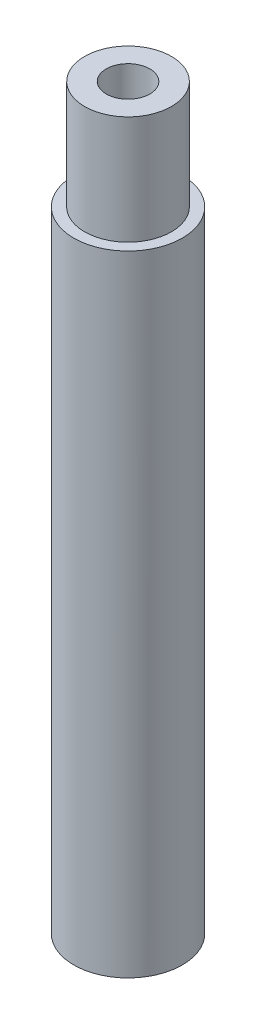
ISO-10303-21;
HEADER;
FILE_DESCRIPTION(('STEP AP214'),'2;1');
FILE_NAME('part.step','',(''),(''),'','','');
FILE_SCHEMA(('AUTOMOTIVE_DESIGN { 1 0 10303 214 1 1 1 1 }'));
ENDSEC;
DATA;
#1=APPLICATION_CONTEXT('core data for automotive mechanical design processes');
#2=APPLICATION_PROTOCOL_DEFINITION('international standard','automotive_design',2000,#1);
#3=PRODUCT_CONTEXT('',#1,'mechanical');
#4=PRODUCT('Part','Part','',(#3));
#5=PRODUCT_RELATED_PRODUCT_CATEGORY('part','',(#4));
#6=PRODUCT_DEFINITION_FORMATION('','',#4);
#7=PRODUCT_DEFINITION_CONTEXT('part definition',#1,'design');
#8=PRODUCT_DEFINITION('design','',#6,#7);
#9=PRODUCT_DEFINITION_SHAPE('','',#8);
#10=(LENGTH_UNIT() NAMED_UNIT(*) SI_UNIT(.MILLI.,.METRE.));
#11=(NAMED_UNIT(*) PLANE_ANGLE_UNIT() SI_UNIT($,.RADIAN.));
#12=(NAMED_UNIT(*) SI_UNIT($,.STERADIAN.) SOLID_ANGLE_UNIT());
#13=UNCERTAINTY_MEASURE_WITH_UNIT(LENGTH_MEASURE(1.E-05),#10,'distance_accuracy_value','');
#14=(GEOMETRIC_REPRESENTATION_CONTEXT(3) GLOBAL_UNCERTAINTY_ASSIGNED_CONTEXT((#13)) GLOBAL_UNIT_ASSIGNED_CONTEXT((#10,
#11,#12)) REPRESENTATION_CONTEXT('',''));
#15=CARTESIAN_POINT('',(0.,0.,0.));
#16=DIRECTION('',(0.,0.,1.));
#17=DIRECTION('',(1.,0.,0.));
#18=AXIS2_PLACEMENT_3D('',#15,#16,#17);
#19=CARTESIAN_POINT('',(0.,203.2,0.));
#20=DIRECTION('',(0.,1.,0.));
#21=DIRECTION('',(0.,0.,1.));
#22=AXIS2_PLACEMENT_3D('',#19,#20,#21);
#23=PLANE('',#22);
#24=CARTESIAN_POINT('',(0.,203.2,0.));
#25=DIRECTION('',(0.,1.,0.));
#26=DIRECTION('',(0.,0.,1.));
#27=AXIS2_PLACEMENT_3D('',#24,#25,#26);
#28=CIRCLE('',#27,6.3754);
#29=CARTESIAN_POINT('',(0.,203.2,6.3754));
#30=VERTEX_POINT('',#29);
#31=EDGE_CURVE('E10',#30,#30,#28,.T.);
#32=ORIENTED_EDGE('',*,*,#31,.F.);
#33=EDGE_LOOP('',(#32));
#34=FACE_BOUND('',#33,.T.);
#35=CARTESIAN_POINT('',(0.,203.2,0.));
#36=DIRECTION('',(0.,1.,0.));
#37=DIRECTION('',(0.,0.,1.));
#38=AXIS2_PLACEMENT_3D('',#35,#36,#37);
#39=CIRCLE('',#38,12.7);
#40=CARTESIAN_POINT('',(0.,203.2,12.7));
#41=VERTEX_POINT('',#40);
#42=EDGE_CURVE('E60',#41,#41,#39,.T.);
#43=ORIENTED_EDGE('',*,*,#42,.T.);
#44=EDGE_LOOP('',(#43));
#45=FACE_BOUND('',#44,.T.);
#46=ADVANCED_FACE('F35',(#34,#45),#23,.T.);
#47=CARTESIAN_POINT('',(0.,203.2,0.));
#48=DIRECTION('',(0.,-1.,0.));
#49=DIRECTION('',(0.,0.,-1.));
#50=AXIS2_PLACEMENT_3D('',#47,#48,#49);
#51=CYLINDRICAL_SURFACE('',#50,15.875);
#52=CARTESIAN_POINT('',(0.,-12.7,0.));
#53=DIRECTION('',(0.,-1.,0.));
#54=DIRECTION('',(0.,0.,-1.));
#55=AXIS2_PLACEMENT_3D('',#52,#53,#54);
#56=CIRCLE('',#55,15.875);
#57=CARTESIAN_POINT('',(0.,-12.7,-15.875));
#58=VERTEX_POINT('',#57);
#59=EDGE_CURVE('E46',#58,#58,#56,.T.);
#60=ORIENTED_EDGE('',*,*,#59,.F.);
#61=EDGE_LOOP('',(#60));
#62=FACE_BOUND('',#61,.T.);
#63=CARTESIAN_POINT('',(0.,171.45,0.));
#64=DIRECTION('',(0.,1.,0.));
#65=DIRECTION('',(0.,0.,1.));
#66=AXIS2_PLACEMENT_3D('',#63,#64,#65);
#67=CIRCLE('',#66,15.875);
#68=CARTESIAN_POINT('',(0.,171.45,15.875));
#69=VERTEX_POINT('',#68);
#70=EDGE_CURVE('E54',#69,#69,#67,.T.);
#71=ORIENTED_EDGE('',*,*,#70,.F.);
#72=EDGE_LOOP('',(#71));
#73=FACE_BOUND('',#72,.T.);
#74=ADVANCED_FACE('F37',(#62,#73),#51,.T.);
#75=CARTESIAN_POINT('',(0.,0.,0.));
#76=DIRECTION('',(0.,1.,0.));
#77=DIRECTION('',(0.,0.,1.));
#78=AXIS2_PLACEMENT_3D('',#75,#76,#77);
#79=PLANE('',#78);
#80=CARTESIAN_POINT('',(0.,0.,0.));
#81=DIRECTION('',(0.,1.,0.));
#82=DIRECTION('',(0.,0.,1.));
#83=AXIS2_PLACEMENT_3D('',#80,#81,#82);
#84=CIRCLE('',#83,6.3754);
#85=CARTESIAN_POINT('',(0.,0.,6.3754));
#86=VERTEX_POINT('',#85);
#87=EDGE_CURVE('E39',#86,#86,#84,.T.);
#88=ORIENTED_EDGE('',*,*,#87,.T.);
#89=EDGE_LOOP('',(#88));
#90=FACE_BOUND('',#89,.T.);
#91=CARTESIAN_POINT('',(0.,0.,0.));
#92=DIRECTION('',(0.,-1.,0.));
#93=DIRECTION('',(0.,0.,-1.));
#94=AXIS2_PLACEMENT_3D('',#91,#92,#93);
#95=CIRCLE('',#94,12.7);
#96=CARTESIAN_POINT('',(0.,0.,-12.7));
#97=VERTEX_POINT('',#96);
#98=EDGE_CURVE('E51',#97,#97,#95,.T.);
#99=ORIENTED_EDGE('',*,*,#98,.T.);
#100=EDGE_LOOP('',(#99));
#101=FACE_BOUND('',#100,.T.);
#102=ADVANCED_FACE('F77',(#90,#101),#79,.F.);
#103=CARTESIAN_POINT('',(0.,203.2,0.));
#104=DIRECTION('',(0.,-1.,0.));
#105=DIRECTION('',(0.,0.,-1.));
#106=AXIS2_PLACEMENT_3D('',#103,#104,#105);
#107=CYLINDRICAL_SURFACE('',#106,6.3754);
#108=ORIENTED_EDGE('',*,*,#31,.T.);
#109=EDGE_LOOP('',(#108));
#110=FACE_BOUND('',#109,.T.);
#111=ORIENTED_EDGE('',*,*,#87,.F.);
#112=EDGE_LOOP('',(#111));
#113=FACE_BOUND('',#112,.T.);
#114=ADVANCED_FACE('F83',(#110,#113),#107,.F.);
#115=CARTESIAN_POINT('',(0.,-12.7,0.));
#116=DIRECTION('',(0.,-1.,0.));
#117=DIRECTION('',(0.,0.,-1.));
#118=AXIS2_PLACEMENT_3D('',#115,#116,#117);
#119=PLANE('',#118);
#120=ORIENTED_EDGE('',*,*,#59,.T.);
#121=EDGE_LOOP('',(#120));
#122=FACE_BOUND('',#121,.T.);
#123=CARTESIAN_POINT('',(0.,-12.7,0.));
#124=DIRECTION('',(0.,-1.,0.));
#125=DIRECTION('',(0.,0.,-1.));
#126=AXIS2_PLACEMENT_3D('',#123,#124,#125);
#127=CIRCLE('',#126,12.7);
#128=CARTESIAN_POINT('',(0.,-12.7,-12.7));
#129=VERTEX_POINT('',#128);
#130=EDGE_CURVE('E50',#129,#129,#127,.T.);
#131=ORIENTED_EDGE('',*,*,#130,.F.);
#132=EDGE_LOOP('',(#131));
#133=FACE_BOUND('',#132,.T.);
#134=ADVANCED_FACE('F89',(#122,#133),#119,.T.);
#135=CARTESIAN_POINT('',(0.,-12.7,0.));
#136=DIRECTION('',(0.,1.,0.));
#137=DIRECTION('',(0.,0.,1.));
#138=AXIS2_PLACEMENT_3D('',#135,#136,#137);
#139=CYLINDRICAL_SURFACE('',#138,12.7);
#140=ORIENTED_EDGE('',*,*,#130,.T.);
#141=EDGE_LOOP('',(#140));
#142=FACE_BOUND('',#141,.T.);
#143=ORIENTED_EDGE('',*,*,#98,.F.);
#144=EDGE_LOOP('',(#143));
#145=FACE_BOUND('',#144,.T.);
#146=ADVANCED_FACE('F72',(#142,#145),#139,.F.);
#147=CARTESIAN_POINT('',(0.,171.45,0.));
#148=DIRECTION('',(0.,1.,0.));
#149=DIRECTION('',(0.,0.,1.));
#150=AXIS2_PLACEMENT_3D('',#147,#148,#149);
#151=PLANE('',#150);
#152=CARTESIAN_POINT('',(0.,171.45,0.));
#153=DIRECTION('',(0.,1.,0.));
#154=DIRECTION('',(0.,0.,1.));
#155=AXIS2_PLACEMENT_3D('',#152,#153,#154);
#156=CIRCLE('',#155,12.7);
#157=CARTESIAN_POINT('',(0.,171.45,12.7));
#158=VERTEX_POINT('',#157);
#159=EDGE_CURVE('E59',#158,#158,#156,.T.);
#160=ORIENTED_EDGE('',*,*,#159,.F.);
#161=EDGE_LOOP('',(#160));
#162=FACE_BOUND('',#161,.T.);
#163=ORIENTED_EDGE('',*,*,#70,.T.);
#164=EDGE_LOOP('',(#163));
#165=FACE_BOUND('',#164,.T.);
#166=ADVANCED_FACE('F69',(#162,#165),#151,.T.);
#167=CARTESIAN_POINT('',(0.,171.45,0.));
#168=DIRECTION('',(0.,1.,0.));
#169=DIRECTION('',(0.,0.,1.));
#170=AXIS2_PLACEMENT_3D('',#167,#168,#169);
#171=CYLINDRICAL_SURFACE('',#170,12.7);
#172=ORIENTED_EDGE('',*,*,#159,.T.);
#173=EDGE_LOOP('',(#172));
#174=FACE_BOUND('',#173,.T.);
#175=ORIENTED_EDGE('',*,*,#42,.F.);
#176=EDGE_LOOP('',(#175));
#177=FACE_BOUND('',#176,.T.);
#178=ADVANCED_FACE('F66',(#174,#177),#171,.T.);
#179=CLOSED_SHELL('',(#46,#74,#102,#114,#134,#146,#166,#178));
#180=MANIFOLD_SOLID_BREP('B2',#179);
#181=ADVANCED_BREP_SHAPE_REPRESENTATION('',(#18,#180),#14);
#182=SHAPE_DEFINITION_REPRESENTATION(#9,#181);
ENDSEC;
END-ISO-10303-21;
